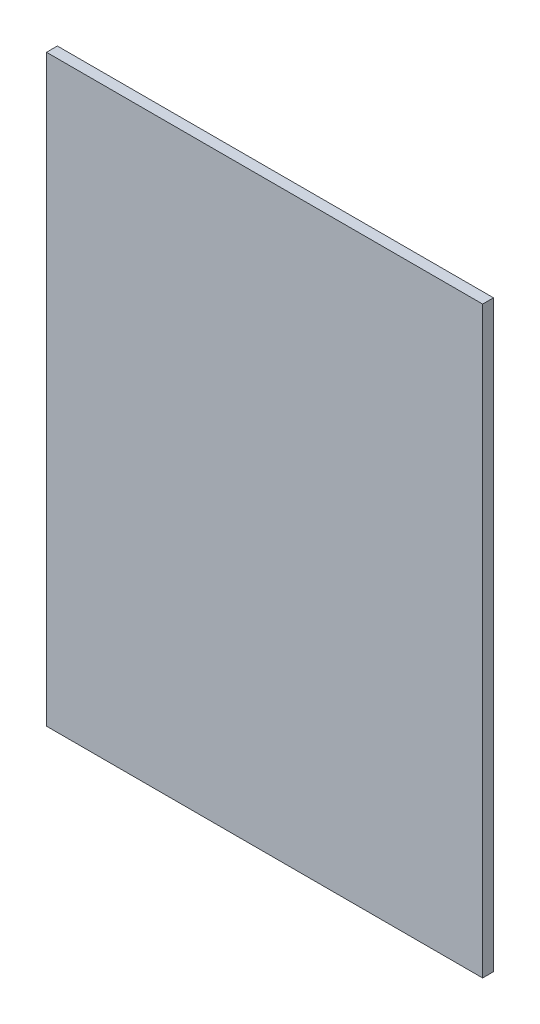
ISO-10303-21;
HEADER;
FILE_DESCRIPTION(('STEP AP214'),'2;1');
FILE_NAME('part.step','',(''),(''),'','','');
FILE_SCHEMA(('AUTOMOTIVE_DESIGN { 1 0 10303 214 1 1 1 1 }'));
ENDSEC;
DATA;
#1=APPLICATION_CONTEXT('core data for automotive mechanical design processes');
#2=APPLICATION_PROTOCOL_DEFINITION('international standard','automotive_design',2000,#1);
#3=PRODUCT_CONTEXT('',#1,'mechanical');
#4=PRODUCT('Part','Part','',(#3));
#5=PRODUCT_RELATED_PRODUCT_CATEGORY('part','',(#4));
#6=PRODUCT_DEFINITION_FORMATION('','',#4);
#7=PRODUCT_DEFINITION_CONTEXT('part definition',#1,'design');
#8=PRODUCT_DEFINITION('design','',#6,#7);
#9=PRODUCT_DEFINITION_SHAPE('','',#8);
#10=(LENGTH_UNIT() NAMED_UNIT(*) SI_UNIT(.MILLI.,.METRE.));
#11=(NAMED_UNIT(*) PLANE_ANGLE_UNIT() SI_UNIT($,.RADIAN.));
#12=(NAMED_UNIT(*) SI_UNIT($,.STERADIAN.) SOLID_ANGLE_UNIT());
#13=UNCERTAINTY_MEASURE_WITH_UNIT(LENGTH_MEASURE(1.E-05),#10,'distance_accuracy_value','');
#14=(GEOMETRIC_REPRESENTATION_CONTEXT(3) GLOBAL_UNCERTAINTY_ASSIGNED_CONTEXT((#13)) GLOBAL_UNIT_ASSIGNED_CONTEXT((#10,
#11,#12)) REPRESENTATION_CONTEXT('',''));
#15=CARTESIAN_POINT('',(0.,0.,0.));
#16=DIRECTION('',(0.,0.,1.));
#17=DIRECTION('',(1.,0.,0.));
#18=AXIS2_PLACEMENT_3D('',#15,#16,#17);
#19=CARTESIAN_POINT('',(0.,0.,12.7));
#20=DIRECTION('',(1.,0.,0.));
#21=DIRECTION('',(0.,0.,-1.));
#22=AXIS2_PLACEMENT_3D('',#19,#20,#21);
#23=PLANE('',#22);
#24=DIRECTION('',(0.,-1.,0.));
#25=VECTOR('',#24,1.);
#26=CARTESIAN_POINT('',(0.,0.,0.));
#27=LINE('',#26,#25);
#28=CARTESIAN_POINT('',(0.,683.26,0.));
#29=VERTEX_POINT('',#28);
#30=CARTESIAN_POINT('',(0.,0.,0.));
#31=VERTEX_POINT('',#30);
#32=EDGE_CURVE('E104',#29,#31,#27,.T.);
#33=ORIENTED_EDGE('',*,*,#32,.T.);
#34=DIRECTION('',(0.,0.,-1.));
#35=VECTOR('',#34,1.);
#36=CARTESIAN_POINT('',(0.,0.,12.7));
#37=LINE('',#36,#35);
#38=CARTESIAN_POINT('',(0.,0.,12.7));
#39=VERTEX_POINT('',#38);
#40=EDGE_CURVE('E11',#39,#31,#37,.T.);
#41=ORIENTED_EDGE('',*,*,#40,.F.);
#42=DIRECTION('',(0.,-1.,0.));
#43=VECTOR('',#42,1.);
#44=CARTESIAN_POINT('',(0.,0.,12.7));
#45=LINE('',#44,#43);
#46=CARTESIAN_POINT('',(0.,683.26,12.7));
#47=VERTEX_POINT('',#46);
#48=EDGE_CURVE('E92',#47,#39,#45,.T.);
#49=ORIENTED_EDGE('',*,*,#48,.F.);
#50=DIRECTION('',(0.,0.,-1.));
#51=VECTOR('',#50,1.);
#52=CARTESIAN_POINT('',(0.,683.26,12.7));
#53=LINE('',#52,#51);
#54=EDGE_CURVE('E100',#47,#29,#53,.T.);
#55=ORIENTED_EDGE('',*,*,#54,.T.);
#56=EDGE_LOOP('',(#33,#41,#49,#55));
#57=FACE_BOUND('',#56,.T.);
#58=ADVANCED_FACE('F41',(#57),#23,.F.);
#59=CARTESIAN_POINT('',(0.,0.,12.7));
#60=DIRECTION('',(0.,1.,0.));
#61=DIRECTION('',(0.,0.,1.));
#62=AXIS2_PLACEMENT_3D('',#59,#60,#61);
#63=PLANE('',#62);
#64=DIRECTION('',(1.,0.,0.));
#65=VECTOR('',#64,1.);
#66=CARTESIAN_POINT('',(0.,0.,0.));
#67=LINE('',#66,#65);
#68=CARTESIAN_POINT('',(510.54,0.,0.));
#69=VERTEX_POINT('',#68);
#70=EDGE_CURVE('E96',#31,#69,#67,.T.);
#71=ORIENTED_EDGE('',*,*,#70,.T.);
#72=DIRECTION('',(0.,0.,-1.));
#73=VECTOR('',#72,1.);
#74=CARTESIAN_POINT('',(510.54,0.,12.7));
#75=LINE('',#74,#73);
#76=CARTESIAN_POINT('',(510.54,0.,12.7));
#77=VERTEX_POINT('',#76);
#78=EDGE_CURVE('E49',#77,#69,#75,.T.);
#79=ORIENTED_EDGE('',*,*,#78,.F.);
#80=DIRECTION('',(1.,0.,0.));
#81=VECTOR('',#80,1.);
#82=CARTESIAN_POINT('',(0.,0.,12.7));
#83=LINE('',#82,#81);
#84=EDGE_CURVE('E87',#39,#77,#83,.T.);
#85=ORIENTED_EDGE('',*,*,#84,.F.);
#86=ORIENTED_EDGE('',*,*,#40,.T.);
#87=EDGE_LOOP('',(#71,#79,#85,#86));
#88=FACE_BOUND('',#87,.T.);
#89=ADVANCED_FACE('F95',(#88),#63,.F.);
#90=CARTESIAN_POINT('',(510.54,0.,12.7));
#91=DIRECTION('',(-1.,0.,0.));
#92=DIRECTION('',(0.,0.,1.));
#93=AXIS2_PLACEMENT_3D('',#90,#91,#92);
#94=PLANE('',#93);
#95=DIRECTION('',(0.,1.,0.));
#96=VECTOR('',#95,1.);
#97=CARTESIAN_POINT('',(510.54,0.,0.));
#98=LINE('',#97,#96);
#99=CARTESIAN_POINT('',(510.54,683.26,0.));
#100=VERTEX_POINT('',#99);
#101=EDGE_CURVE('E74',#69,#100,#98,.T.);
#102=ORIENTED_EDGE('',*,*,#101,.T.);
#103=DIRECTION('',(0.,0.,-1.));
#104=VECTOR('',#103,1.);
#105=CARTESIAN_POINT('',(510.54,683.26,12.7));
#106=LINE('',#105,#104);
#107=CARTESIAN_POINT('',(510.54,683.26,12.7));
#108=VERTEX_POINT('',#107);
#109=EDGE_CURVE('E97',#108,#100,#106,.T.);
#110=ORIENTED_EDGE('',*,*,#109,.F.);
#111=DIRECTION('',(0.,1.,0.));
#112=VECTOR('',#111,1.);
#113=CARTESIAN_POINT('',(510.54,0.,12.7));
#114=LINE('',#113,#112);
#115=EDGE_CURVE('E90',#77,#108,#114,.T.);
#116=ORIENTED_EDGE('',*,*,#115,.F.);
#117=ORIENTED_EDGE('',*,*,#78,.T.);
#118=EDGE_LOOP('',(#102,#110,#116,#117));
#119=FACE_BOUND('',#118,.T.);
#120=ADVANCED_FACE('F98',(#119),#94,.F.);
#121=CARTESIAN_POINT('',(0.,683.26,12.7));
#122=DIRECTION('',(0.,-1.,0.));
#123=DIRECTION('',(1.,0.,0.));
#124=AXIS2_PLACEMENT_3D('',#121,#122,#123);
#125=PLANE('',#124);
#126=DIRECTION('',(-1.,0.,0.));
#127=VECTOR('',#126,1.);
#128=CARTESIAN_POINT('',(0.,683.26,0.));
#129=LINE('',#128,#127);
#130=EDGE_CURVE('E80',#100,#29,#129,.T.);
#131=ORIENTED_EDGE('',*,*,#130,.T.);
#132=ORIENTED_EDGE('',*,*,#54,.F.);
#133=DIRECTION('',(-1.,0.,0.));
#134=VECTOR('',#133,1.);
#135=CARTESIAN_POINT('',(0.,683.26,12.7));
#136=LINE('',#135,#134);
#137=EDGE_CURVE('E57',#108,#47,#136,.T.);
#138=ORIENTED_EDGE('',*,*,#137,.F.);
#139=ORIENTED_EDGE('',*,*,#109,.T.);
#140=EDGE_LOOP('',(#131,#132,#138,#139));
#141=FACE_BOUND('',#140,.T.);
#142=ADVANCED_FACE('F111',(#141),#125,.F.);
#143=CARTESIAN_POINT('',(0.,0.,12.7));
#144=DIRECTION('',(0.,0.,-1.));
#145=DIRECTION('',(-1.,0.,0.));
#146=AXIS2_PLACEMENT_3D('',#143,#144,#145);
#147=PLANE('',#146);
#148=ORIENTED_EDGE('',*,*,#48,.T.);
#149=ORIENTED_EDGE('',*,*,#84,.T.);
#150=ORIENTED_EDGE('',*,*,#115,.T.);
#151=ORIENTED_EDGE('',*,*,#137,.T.);
#152=EDGE_LOOP('',(#148,#149,#150,#151));
#153=FACE_BOUND('',#152,.T.);
#154=ADVANCED_FACE('F88',(#153),#147,.F.);
#155=CARTESIAN_POINT('',(0.,0.,0.));
#156=DIRECTION('',(0.,0.,-1.));
#157=DIRECTION('',(-1.,0.,0.));
#158=AXIS2_PLACEMENT_3D('',#155,#156,#157);
#159=PLANE('',#158);
#160=ORIENTED_EDGE('',*,*,#32,.F.);
#161=ORIENTED_EDGE('',*,*,#130,.F.);
#162=ORIENTED_EDGE('',*,*,#101,.F.);
#163=ORIENTED_EDGE('',*,*,#70,.F.);
#164=EDGE_LOOP('',(#160,#161,#162,#163));
#165=FACE_BOUND('',#164,.T.);
#166=ADVANCED_FACE('F114',(#165),#159,.T.);
#167=CLOSED_SHELL('',(#58,#89,#120,#142,#154,#166));
#168=MANIFOLD_SOLID_BREP('B2',#167);
#169=ADVANCED_BREP_SHAPE_REPRESENTATION('',(#18,#168),#14);
#170=SHAPE_DEFINITION_REPRESENTATION(#9,#169);
ENDSEC;
END-ISO-10303-21;
